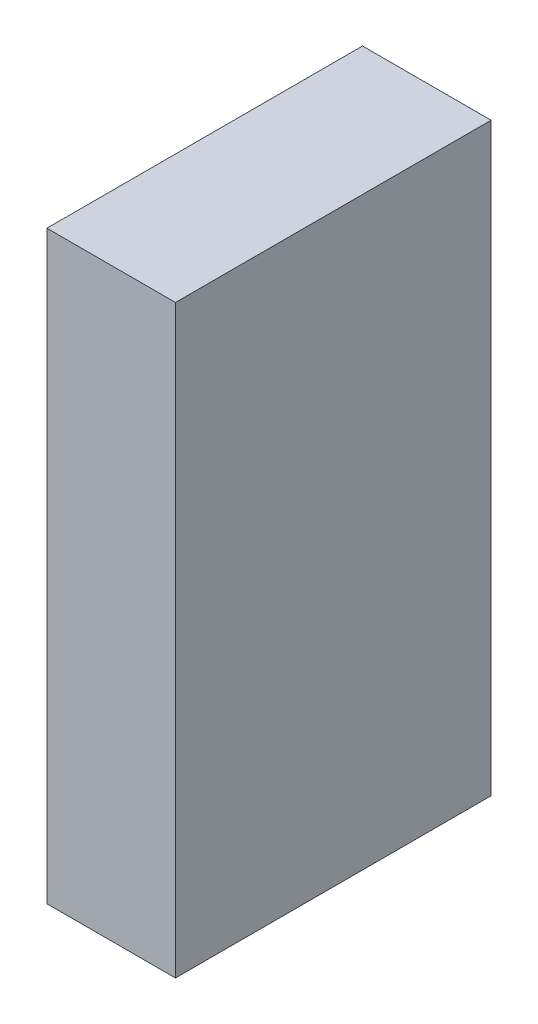
ISO-10303-21;
HEADER;
FILE_DESCRIPTION(('STEP AP214'),'2;1');
FILE_NAME('part.step','',(''),(''),'','','');
FILE_SCHEMA(('AUTOMOTIVE_DESIGN { 1 0 10303 214 1 1 1 1 }'));
ENDSEC;
DATA;
#1=APPLICATION_CONTEXT('core data for automotive mechanical design processes');
#2=APPLICATION_PROTOCOL_DEFINITION('international standard','automotive_design',2000,#1);
#3=PRODUCT_CONTEXT('',#1,'mechanical');
#4=PRODUCT('Part','Part','',(#3));
#5=PRODUCT_RELATED_PRODUCT_CATEGORY('part','',(#4));
#6=PRODUCT_DEFINITION_FORMATION('','',#4);
#7=PRODUCT_DEFINITION_CONTEXT('part definition',#1,'design');
#8=PRODUCT_DEFINITION('design','',#6,#7);
#9=PRODUCT_DEFINITION_SHAPE('','',#8);
#10=(LENGTH_UNIT() NAMED_UNIT(*) SI_UNIT(.MILLI.,.METRE.));
#11=(NAMED_UNIT(*) PLANE_ANGLE_UNIT() SI_UNIT($,.RADIAN.));
#12=(NAMED_UNIT(*) SI_UNIT($,.STERADIAN.) SOLID_ANGLE_UNIT());
#13=UNCERTAINTY_MEASURE_WITH_UNIT(LENGTH_MEASURE(1.E-05),#10,'distance_accuracy_value','');
#14=(GEOMETRIC_REPRESENTATION_CONTEXT(3) GLOBAL_UNCERTAINTY_ASSIGNED_CONTEXT((#13)) GLOBAL_UNIT_ASSIGNED_CONTEXT((#10,
#11,#12)) REPRESENTATION_CONTEXT('',''));
#15=CARTESIAN_POINT('',(0.,0.,0.));
#16=DIRECTION('',(0.,0.,1.));
#17=DIRECTION('',(1.,0.,0.));
#18=AXIS2_PLACEMENT_3D('',#15,#16,#17);
#19=CARTESIAN_POINT('',(0.,0.,0.));
#20=DIRECTION('',(0.,-1.,0.));
#21=DIRECTION('',(0.,0.,-1.));
#22=AXIS2_PLACEMENT_3D('',#19,#20,#21);
#23=PLANE('',#22);
#24=DIRECTION('',(0.,0.,-1.));
#25=VECTOR('',#24,1.);
#26=CARTESIAN_POINT('',(11.,0.,27.));
#27=LINE('',#26,#25);
#28=CARTESIAN_POINT('',(11.,0.,27.));
#29=VERTEX_POINT('',#28);
#30=CARTESIAN_POINT('',(11.,0.,-27.));
#31=VERTEX_POINT('',#30);
#32=EDGE_CURVE('E169',#29,#31,#27,.T.);
#33=ORIENTED_EDGE('',*,*,#32,.F.);
#34=DIRECTION('',(1.,0.,0.));
#35=VECTOR('',#34,1.);
#36=CARTESIAN_POINT('',(-11.,0.,27.));
#37=LINE('',#36,#35);
#38=CARTESIAN_POINT('',(-11.,0.,27.));
#39=VERTEX_POINT('',#38);
#40=EDGE_CURVE('E67',#39,#29,#37,.T.);
#41=ORIENTED_EDGE('',*,*,#40,.F.);
#42=DIRECTION('',(0.,0.,1.));
#43=VECTOR('',#42,1.);
#44=CARTESIAN_POINT('',(-11.,0.,27.));
#45=LINE('',#44,#43);
#46=CARTESIAN_POINT('',(-11.,0.,-27.));
#47=VERTEX_POINT('',#46);
#48=EDGE_CURVE('E173',#47,#39,#45,.T.);
#49=ORIENTED_EDGE('',*,*,#48,.F.);
#50=DIRECTION('',(-1.,0.,0.));
#51=VECTOR('',#50,1.);
#52=CARTESIAN_POINT('',(-11.,0.,-27.));
#53=LINE('',#52,#51);
#54=EDGE_CURVE('E171',#31,#47,#53,.T.);
#55=ORIENTED_EDGE('',*,*,#54,.F.);
#56=EDGE_LOOP('',(#33,#41,#49,#55));
#57=FACE_BOUND('',#56,.T.);
#58=DIRECTION('',(1.,0.,0.));
#59=VECTOR('',#58,1.);
#60=CARTESIAN_POINT('',(-9.,0.,25.));
#61=LINE('',#60,#59);
#62=CARTESIAN_POINT('',(-9.,0.,25.));
#63=VERTEX_POINT('',#62);
#64=CARTESIAN_POINT('',(9.,0.,25.));
#65=VERTEX_POINT('',#64);
#66=EDGE_CURVE('E143',#63,#65,#61,.T.);
#67=ORIENTED_EDGE('',*,*,#66,.T.);
#68=DIRECTION('',(0.,0.,-1.));
#69=VECTOR('',#68,1.);
#70=CARTESIAN_POINT('',(9.,0.,25.));
#71=LINE('',#70,#69);
#72=CARTESIAN_POINT('',(9.,0.,-25.));
#73=VERTEX_POINT('',#72);
#74=EDGE_CURVE('E59',#65,#73,#71,.T.);
#75=ORIENTED_EDGE('',*,*,#74,.T.);
#76=DIRECTION('',(-1.,0.,0.));
#77=VECTOR('',#76,1.);
#78=CARTESIAN_POINT('',(-9.,0.,-25.));
#79=LINE('',#78,#77);
#80=CARTESIAN_POINT('',(-9.,0.,-25.));
#81=VERTEX_POINT('',#80);
#82=EDGE_CURVE('E154',#73,#81,#79,.T.);
#83=ORIENTED_EDGE('',*,*,#82,.T.);
#84=DIRECTION('',(0.,0.,1.));
#85=VECTOR('',#84,1.);
#86=CARTESIAN_POINT('',(-9.,0.,25.));
#87=LINE('',#86,#85);
#88=EDGE_CURVE('E157',#81,#63,#87,.T.);
#89=ORIENTED_EDGE('',*,*,#88,.T.);
#90=EDGE_LOOP('',(#67,#75,#83,#89));
#91=FACE_BOUND('',#90,.T.);
#92=ADVANCED_FACE('F43',(#57,#91),#23,.T.);
#93=CARTESIAN_POINT('',(11.,100.,27.));
#94=DIRECTION('',(-1.,0.,0.));
#95=DIRECTION('',(0.,0.,1.));
#96=AXIS2_PLACEMENT_3D('',#93,#94,#95);
#97=PLANE('',#96);
#98=ORIENTED_EDGE('',*,*,#32,.T.);
#99=DIRECTION('',(0.,-1.,0.));
#100=VECTOR('',#99,1.);
#101=CARTESIAN_POINT('',(11.,100.,-27.));
#102=LINE('',#101,#100);
#103=CARTESIAN_POINT('',(11.,100.1,-27.));
#104=VERTEX_POINT('',#103);
#105=EDGE_CURVE('E123',#104,#31,#102,.T.);
#106=ORIENTED_EDGE('',*,*,#105,.F.);
#107=DIRECTION('',(0.,0.,-1.));
#108=VECTOR('',#107,1.);
#109=CARTESIAN_POINT('',(11.,100.1,27.));
#110=LINE('',#109,#108);
#111=CARTESIAN_POINT('',(11.,100.1,27.));
#112=VERTEX_POINT('',#111);
#113=EDGE_CURVE('E121',#112,#104,#110,.T.);
#114=ORIENTED_EDGE('',*,*,#113,.F.);
#115=DIRECTION('',(0.,-1.,0.));
#116=VECTOR('',#115,1.);
#117=CARTESIAN_POINT('',(11.,100.,27.));
#118=LINE('',#117,#116);
#119=EDGE_CURVE('E110',#112,#29,#118,.T.);
#120=ORIENTED_EDGE('',*,*,#119,.T.);
#121=EDGE_LOOP('',(#98,#106,#114,#120));
#122=FACE_BOUND('',#121,.T.);
#123=ADVANCED_FACE('F45',(#122),#97,.F.);
#124=CARTESIAN_POINT('',(-11.,100.,-27.));
#125=DIRECTION('',(0.,0.,1.));
#126=DIRECTION('',(1.,0.,0.));
#127=AXIS2_PLACEMENT_3D('',#124,#125,#126);
#128=PLANE('',#127);
#129=ORIENTED_EDGE('',*,*,#54,.T.);
#130=DIRECTION('',(0.,-1.,0.));
#131=VECTOR('',#130,1.);
#132=CARTESIAN_POINT('',(-11.,100.,-27.));
#133=LINE('',#132,#131);
#134=CARTESIAN_POINT('',(-11.,100.1,-27.));
#135=VERTEX_POINT('',#134);
#136=EDGE_CURVE('E177',#135,#47,#133,.T.);
#137=ORIENTED_EDGE('',*,*,#136,.F.);
#138=DIRECTION('',(-1.,0.,0.));
#139=VECTOR('',#138,1.);
#140=CARTESIAN_POINT('',(11.,100.1,-27.));
#141=LINE('',#140,#139);
#142=EDGE_CURVE('E127',#104,#135,#141,.T.);
#143=ORIENTED_EDGE('',*,*,#142,.F.);
#144=ORIENTED_EDGE('',*,*,#105,.T.);
#145=EDGE_LOOP('',(#129,#137,#143,#144));
#146=FACE_BOUND('',#145,.T.);
#147=ADVANCED_FACE('F222',(#146),#128,.F.);
#148=CARTESIAN_POINT('',(-11.,100.,27.));
#149=DIRECTION('',(1.,0.,0.));
#150=DIRECTION('',(0.,0.,-1.));
#151=AXIS2_PLACEMENT_3D('',#148,#149,#150);
#152=PLANE('',#151);
#153=ORIENTED_EDGE('',*,*,#48,.T.);
#154=DIRECTION('',(0.,-1.,0.));
#155=VECTOR('',#154,1.);
#156=CARTESIAN_POINT('',(-11.,100.,27.));
#157=LINE('',#156,#155);
#158=CARTESIAN_POINT('',(-11.,100.1,27.));
#159=VERTEX_POINT('',#158);
#160=EDGE_CURVE('E118',#159,#39,#157,.T.);
#161=ORIENTED_EDGE('',*,*,#160,.F.);
#162=DIRECTION('',(0.,0.,1.));
#163=VECTOR('',#162,1.);
#164=CARTESIAN_POINT('',(-11.,100.1,-27.));
#165=LINE('',#164,#163);
#166=EDGE_CURVE('E132',#135,#159,#165,.T.);
#167=ORIENTED_EDGE('',*,*,#166,.F.);
#168=ORIENTED_EDGE('',*,*,#136,.T.);
#169=EDGE_LOOP('',(#153,#161,#167,#168));
#170=FACE_BOUND('',#169,.T.);
#171=ADVANCED_FACE('F228',(#170),#152,.F.);
#172=CARTESIAN_POINT('',(-11.,100.,27.));
#173=DIRECTION('',(0.,0.,-1.));
#174=DIRECTION('',(-1.,0.,0.));
#175=AXIS2_PLACEMENT_3D('',#172,#173,#174);
#176=PLANE('',#175);
#177=ORIENTED_EDGE('',*,*,#40,.T.);
#178=ORIENTED_EDGE('',*,*,#119,.F.);
#179=DIRECTION('',(1.,0.,0.));
#180=VECTOR('',#179,1.);
#181=CARTESIAN_POINT('',(-11.,100.1,27.));
#182=LINE('',#181,#180);
#183=EDGE_CURVE('E114',#159,#112,#182,.T.);
#184=ORIENTED_EDGE('',*,*,#183,.F.);
#185=ORIENTED_EDGE('',*,*,#160,.T.);
#186=EDGE_LOOP('',(#177,#178,#184,#185));
#187=FACE_BOUND('',#186,.T.);
#188=ADVANCED_FACE('F112',(#187),#176,.F.);
#189=CARTESIAN_POINT('',(9.,100.,25.));
#190=DIRECTION('',(-1.,0.,0.));
#191=DIRECTION('',(0.,0.,1.));
#192=AXIS2_PLACEMENT_3D('',#189,#190,#191);
#193=PLANE('',#192);
#194=CARTESIAN_POINT('',(9.,53.0628931047327,0.));
#195=DIRECTION('',(-1.,0.,0.));
#196=DIRECTION('',(0.,0.,1.));
#197=AXIS2_PLACEMENT_3D('',#194,#195,#196);
#198=CIRCLE('',#197,2.);
#199=CARTESIAN_POINT('',(9.,53.0628931047327,2.));
#200=VERTEX_POINT('',#199);
#201=EDGE_CURVE('E11',#200,#200,#198,.T.);
#202=ORIENTED_EDGE('',*,*,#201,.F.);
#203=EDGE_LOOP('',(#202));
#204=FACE_BOUND('',#203,.T.);
#205=CARTESIAN_POINT('',(9.,64.0628931047327,0.));
#206=DIRECTION('',(-1.,0.,0.));
#207=DIRECTION('',(0.,0.,1.));
#208=AXIS2_PLACEMENT_3D('',#205,#206,#207);
#209=CIRCLE('',#208,2.);
#210=CARTESIAN_POINT('',(9.,64.0628931047327,2.));
#211=VERTEX_POINT('',#210);
#212=EDGE_CURVE('E135',#211,#211,#209,.T.);
#213=ORIENTED_EDGE('',*,*,#212,.F.);
#214=EDGE_LOOP('',(#213));
#215=FACE_BOUND('',#214,.T.);
#216=ORIENTED_EDGE('',*,*,#74,.F.);
#217=DIRECTION('',(0.,-1.,0.));
#218=VECTOR('',#217,1.);
#219=CARTESIAN_POINT('',(9.,100.,25.));
#220=LINE('',#219,#218);
#221=CARTESIAN_POINT('',(9.,100.,25.));
#222=VERTEX_POINT('',#221);
#223=EDGE_CURVE('E152',#222,#65,#220,.T.);
#224=ORIENTED_EDGE('',*,*,#223,.F.);
#225=DIRECTION('',(0.,0.,-1.));
#226=VECTOR('',#225,1.);
#227=CARTESIAN_POINT('',(9.,100.,25.));
#228=LINE('',#227,#226);
#229=CARTESIAN_POINT('',(9.,100.,-25.));
#230=VERTEX_POINT('',#229);
#231=EDGE_CURVE('E139',#222,#230,#228,.T.);
#232=ORIENTED_EDGE('',*,*,#231,.T.);
#233=DIRECTION('',(0.,-1.,0.));
#234=VECTOR('',#233,1.);
#235=CARTESIAN_POINT('',(9.,100.,-25.));
#236=LINE('',#235,#234);
#237=EDGE_CURVE('E167',#230,#73,#236,.T.);
#238=ORIENTED_EDGE('',*,*,#237,.T.);
#239=EDGE_LOOP('',(#216,#224,#232,#238));
#240=FACE_BOUND('',#239,.T.);
#241=ADVANCED_FACE('F206',(#204,#215,#240),#193,.T.);
#242=CARTESIAN_POINT('',(-9.,100.,-25.));
#243=DIRECTION('',(0.,0.,1.));
#244=DIRECTION('',(1.,0.,0.));
#245=AXIS2_PLACEMENT_3D('',#242,#243,#244);
#246=PLANE('',#245);
#247=ORIENTED_EDGE('',*,*,#82,.F.);
#248=ORIENTED_EDGE('',*,*,#237,.F.);
#249=DIRECTION('',(-1.,0.,0.));
#250=VECTOR('',#249,1.);
#251=CARTESIAN_POINT('',(-9.,100.,-25.));
#252=LINE('',#251,#250);
#253=CARTESIAN_POINT('',(-9.,100.,-25.));
#254=VERTEX_POINT('',#253);
#255=EDGE_CURVE('E142',#230,#254,#252,.T.);
#256=ORIENTED_EDGE('',*,*,#255,.T.);
#257=DIRECTION('',(0.,-1.,0.));
#258=VECTOR('',#257,1.);
#259=CARTESIAN_POINT('',(-9.,100.,-25.));
#260=LINE('',#259,#258);
#261=EDGE_CURVE('E165',#254,#81,#260,.T.);
#262=ORIENTED_EDGE('',*,*,#261,.T.);
#263=EDGE_LOOP('',(#247,#248,#256,#262));
#264=FACE_BOUND('',#263,.T.);
#265=ADVANCED_FACE('F196',(#264),#246,.T.);
#266=CARTESIAN_POINT('',(-9.,100.,25.));
#267=DIRECTION('',(1.,0.,0.));
#268=DIRECTION('',(0.,0.,-1.));
#269=AXIS2_PLACEMENT_3D('',#266,#267,#268);
#270=PLANE('',#269);
#271=CARTESIAN_POINT('',(-9.,53.0628931047327,0.));
#272=DIRECTION('',(1.,0.,0.));
#273=DIRECTION('',(0.,0.,-1.));
#274=AXIS2_PLACEMENT_3D('',#271,#272,#273);
#275=CIRCLE('',#274,2.);
#276=CARTESIAN_POINT('',(-9.,53.0628931047327,-2.));
#277=VERTEX_POINT('',#276);
#278=EDGE_CURVE('E47',#277,#277,#275,.T.);
#279=ORIENTED_EDGE('',*,*,#278,.F.);
#280=EDGE_LOOP('',(#279));
#281=FACE_BOUND('',#280,.T.);
#282=CARTESIAN_POINT('',(-9.,64.0628931047327,0.));
#283=DIRECTION('',(1.,0.,0.));
#284=DIRECTION('',(0.,0.,-1.));
#285=AXIS2_PLACEMENT_3D('',#282,#283,#284);
#286=CIRCLE('',#285,2.);
#287=CARTESIAN_POINT('',(-9.,64.0628931047327,-2.));
#288=VERTEX_POINT('',#287);
#289=EDGE_CURVE('E180',#288,#288,#286,.T.);
#290=ORIENTED_EDGE('',*,*,#289,.F.);
#291=EDGE_LOOP('',(#290));
#292=FACE_BOUND('',#291,.T.);
#293=ORIENTED_EDGE('',*,*,#88,.F.);
#294=ORIENTED_EDGE('',*,*,#261,.F.);
#295=DIRECTION('',(0.,0.,1.));
#296=VECTOR('',#295,1.);
#297=CARTESIAN_POINT('',(-9.,100.,25.));
#298=LINE('',#297,#296);
#299=CARTESIAN_POINT('',(-9.,100.,25.));
#300=VERTEX_POINT('',#299);
#301=EDGE_CURVE('E146',#254,#300,#298,.T.);
#302=ORIENTED_EDGE('',*,*,#301,.T.);
#303=DIRECTION('',(0.,-1.,0.));
#304=VECTOR('',#303,1.);
#305=CARTESIAN_POINT('',(-9.,100.,25.));
#306=LINE('',#305,#304);
#307=EDGE_CURVE('E163',#300,#63,#306,.T.);
#308=ORIENTED_EDGE('',*,*,#307,.T.);
#309=EDGE_LOOP('',(#293,#294,#302,#308));
#310=FACE_BOUND('',#309,.T.);
#311=ADVANCED_FACE('F192',(#281,#292,#310),#270,.T.);
#312=CARTESIAN_POINT('',(-9.,100.,25.));
#313=DIRECTION('',(0.,0.,-1.));
#314=DIRECTION('',(-1.,0.,0.));
#315=AXIS2_PLACEMENT_3D('',#312,#313,#314);
#316=PLANE('',#315);
#317=ORIENTED_EDGE('',*,*,#66,.F.);
#318=ORIENTED_EDGE('',*,*,#307,.F.);
#319=DIRECTION('',(1.,0.,0.));
#320=VECTOR('',#319,1.);
#321=CARTESIAN_POINT('',(-9.,100.,25.));
#322=LINE('',#321,#320);
#323=EDGE_CURVE('E149',#300,#222,#322,.T.);
#324=ORIENTED_EDGE('',*,*,#323,.T.);
#325=ORIENTED_EDGE('',*,*,#223,.T.);
#326=EDGE_LOOP('',(#317,#318,#324,#325));
#327=FACE_BOUND('',#326,.T.);
#328=ADVANCED_FACE('F195',(#327),#316,.T.);
#329=CARTESIAN_POINT('',(0.,100.,0.));
#330=DIRECTION('',(0.,1.,0.));
#331=DIRECTION('',(0.,0.,1.));
#332=AXIS2_PLACEMENT_3D('',#329,#330,#331);
#333=PLANE('',#332);
#334=ORIENTED_EDGE('',*,*,#231,.F.);
#335=ORIENTED_EDGE('',*,*,#323,.F.);
#336=ORIENTED_EDGE('',*,*,#301,.F.);
#337=ORIENTED_EDGE('',*,*,#255,.F.);
#338=EDGE_LOOP('',(#334,#335,#336,#337));
#339=FACE_BOUND('',#338,.T.);
#340=ADVANCED_FACE('F208',(#339),#333,.F.);
#341=CARTESIAN_POINT('',(0.,100.1,0.));
#342=DIRECTION('',(0.,1.,0.));
#343=DIRECTION('',(0.,0.,1.));
#344=AXIS2_PLACEMENT_3D('',#341,#342,#343);
#345=PLANE('',#344);
#346=ORIENTED_EDGE('',*,*,#183,.T.);
#347=ORIENTED_EDGE('',*,*,#113,.T.);
#348=ORIENTED_EDGE('',*,*,#142,.T.);
#349=ORIENTED_EDGE('',*,*,#166,.T.);
#350=EDGE_LOOP('',(#346,#347,#348,#349));
#351=FACE_BOUND('',#350,.T.);
#352=ADVANCED_FACE('F130',(#351),#345,.T.);
#353=CARTESIAN_POINT('',(16.6568542494924,64.0628931047327,0.));
#354=DIRECTION('',(-1.,0.,0.));
#355=DIRECTION('',(0.,0.,1.));
#356=AXIS2_PLACEMENT_3D('',#353,#354,#355);
#357=CYLINDRICAL_SURFACE('',#356,2.);
#358=ORIENTED_EDGE('',*,*,#212,.T.);
#359=EDGE_LOOP('',(#358));
#360=FACE_BOUND('',#359,.T.);
#361=ORIENTED_EDGE('',*,*,#289,.T.);
#362=EDGE_LOOP('',(#361));
#363=FACE_BOUND('',#362,.T.);
#364=ADVANCED_FACE('F268',(#360,#363),#357,.T.);
#365=CARTESIAN_POINT('',(16.6568542494924,53.0628931047327,0.));
#366=DIRECTION('',(-1.,0.,0.));
#367=DIRECTION('',(0.,0.,1.));
#368=AXIS2_PLACEMENT_3D('',#365,#366,#367);
#369=CYLINDRICAL_SURFACE('',#368,2.);
#370=ORIENTED_EDGE('',*,*,#201,.T.);
#371=EDGE_LOOP('',(#370));
#372=FACE_BOUND('',#371,.T.);
#373=ORIENTED_EDGE('',*,*,#278,.T.);
#374=EDGE_LOOP('',(#373));
#375=FACE_BOUND('',#374,.T.);
#376=ADVANCED_FACE('F190',(#372,#375),#369,.T.);
#377=CLOSED_SHELL('',(#92,#123,#147,#171,#188,#241,#265,#311,#328,#340,#352,#364,#376));
#378=MANIFOLD_SOLID_BREP('B2',#377);
#379=ADVANCED_BREP_SHAPE_REPRESENTATION('',(#18,#378),#14);
#380=SHAPE_DEFINITION_REPRESENTATION(#9,#379);
ENDSEC;
END-ISO-10303-21;
